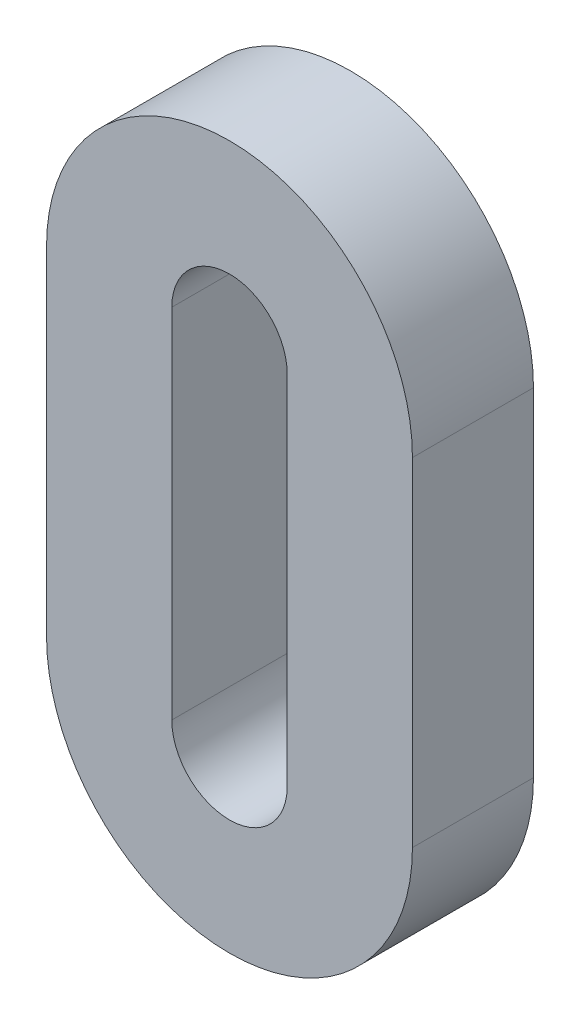
ISO-10303-21;
HEADER;
FILE_DESCRIPTION(('STEP AP214'),'2;1');
FILE_NAME('part.step','',(''),(''),'','','');
FILE_SCHEMA(('AUTOMOTIVE_DESIGN { 1 0 10303 214 1 1 1 1 }'));
ENDSEC;
DATA;
#1=APPLICATION_CONTEXT('core data for automotive mechanical design processes');
#2=APPLICATION_PROTOCOL_DEFINITION('international standard','automotive_design',2000,#1);
#3=PRODUCT_CONTEXT('',#1,'mechanical');
#4=PRODUCT('Part','Part','',(#3));
#5=PRODUCT_RELATED_PRODUCT_CATEGORY('part','',(#4));
#6=PRODUCT_DEFINITION_FORMATION('','',#4);
#7=PRODUCT_DEFINITION_CONTEXT('part definition',#1,'design');
#8=PRODUCT_DEFINITION('design','',#6,#7);
#9=PRODUCT_DEFINITION_SHAPE('','',#8);
#10=(LENGTH_UNIT() NAMED_UNIT(*) SI_UNIT(.MILLI.,.METRE.));
#11=(NAMED_UNIT(*) PLANE_ANGLE_UNIT() SI_UNIT($,.RADIAN.));
#12=(NAMED_UNIT(*) SI_UNIT($,.STERADIAN.) SOLID_ANGLE_UNIT());
#13=UNCERTAINTY_MEASURE_WITH_UNIT(LENGTH_MEASURE(1.E-05),#10,'distance_accuracy_value','');
#14=(GEOMETRIC_REPRESENTATION_CONTEXT(3) GLOBAL_UNCERTAINTY_ASSIGNED_CONTEXT((#13)) GLOBAL_UNIT_ASSIGNED_CONTEXT((#10,
#11,#12)) REPRESENTATION_CONTEXT('',''));
#15=CARTESIAN_POINT('',(0.,0.,0.));
#16=DIRECTION('',(0.,0.,1.));
#17=DIRECTION('',(1.,0.,0.));
#18=AXIS2_PLACEMENT_3D('',#15,#16,#17);
#19=CARTESIAN_POINT('',(-18.0027546578401,6.,4.3));
#20=DIRECTION('',(0.,0.,1.));
#21=DIRECTION('',(1.,0.,0.));
#22=AXIS2_PLACEMENT_3D('',#19,#20,#21);
#23=PLANE('',#22);
#24=CARTESIAN_POINT('',(-18.0027546578401,6.,4.3));
#25=DIRECTION('',(0.,0.,1.));
#26=DIRECTION('',(1.,0.,0.));
#27=AXIS2_PLACEMENT_3D('',#24,#25,#26);
#28=CIRCLE('',#27,6.5);
#29=CARTESIAN_POINT('',(-11.5027546578401,6.,4.3));
#30=VERTEX_POINT('',#29);
#31=CARTESIAN_POINT('',(-24.5027546578401,6.,4.3));
#32=VERTEX_POINT('',#31);
#33=EDGE_CURVE('E134',#30,#32,#28,.T.);
#34=ORIENTED_EDGE('',*,*,#33,.T.);
#35=DIRECTION('',(0.,-1.,0.));
#36=VECTOR('',#35,1.);
#37=CARTESIAN_POINT('',(-24.5027546578401,6.,4.3));
#38=LINE('',#37,#36);
#39=CARTESIAN_POINT('',(-24.5027546578401,-6.,4.3));
#40=VERTEX_POINT('',#39);
#41=EDGE_CURVE('E137',#32,#40,#38,.T.);
#42=ORIENTED_EDGE('',*,*,#41,.T.);
#43=CARTESIAN_POINT('',(-18.0027546578401,-6.,4.3));
#44=DIRECTION('',(0.,0.,1.));
#45=DIRECTION('',(1.,0.,0.));
#46=AXIS2_PLACEMENT_3D('',#43,#44,#45);
#47=CIRCLE('',#46,6.5);
#48=CARTESIAN_POINT('',(-11.5027546578401,-6.,4.3));
#49=VERTEX_POINT('',#48);
#50=EDGE_CURVE('E140',#40,#49,#47,.T.);
#51=ORIENTED_EDGE('',*,*,#50,.T.);
#52=DIRECTION('',(0.,1.,0.));
#53=VECTOR('',#52,1.);
#54=CARTESIAN_POINT('',(-11.5027546578401,6.,4.3));
#55=LINE('',#54,#53);
#56=EDGE_CURVE('E142',#49,#30,#55,.T.);
#57=ORIENTED_EDGE('',*,*,#56,.T.);
#58=EDGE_LOOP('',(#34,#42,#51,#57));
#59=FACE_BOUND('',#58,.T.);
#60=DIRECTION('',(0.,-1.,0.));
#61=VECTOR('',#60,1.);
#62=CARTESIAN_POINT('',(-20.0527546578401,6.35,4.3));
#63=LINE('',#62,#61);
#64=CARTESIAN_POINT('',(-20.0527546578401,6.35,4.3));
#65=VERTEX_POINT('',#64);
#66=CARTESIAN_POINT('',(-20.0527546578401,-6.35,4.3));
#67=VERTEX_POINT('',#66);
#68=EDGE_CURVE('E106',#65,#67,#63,.T.);
#69=ORIENTED_EDGE('',*,*,#68,.F.);
#70=CARTESIAN_POINT('',(-18.0027546578401,6.35,4.3));
#71=DIRECTION('',(0.,0.,1.));
#72=DIRECTION('',(1.,0.,0.));
#73=AXIS2_PLACEMENT_3D('',#70,#71,#72);
#74=CIRCLE('',#73,2.05);
#75=CARTESIAN_POINT('',(-15.9527546578401,6.35,4.3));
#76=VERTEX_POINT('',#75);
#77=EDGE_CURVE('E98',#76,#65,#74,.T.);
#78=ORIENTED_EDGE('',*,*,#77,.F.);
#79=DIRECTION('',(0.,1.,0.));
#80=VECTOR('',#79,1.);
#81=CARTESIAN_POINT('',(-15.9527546578401,6.35,4.3));
#82=LINE('',#81,#80);
#83=CARTESIAN_POINT('',(-15.9527546578401,-6.35,4.3));
#84=VERTEX_POINT('',#83);
#85=EDGE_CURVE('E120',#84,#76,#82,.T.);
#86=ORIENTED_EDGE('',*,*,#85,.F.);
#87=CARTESIAN_POINT('',(-18.0027546578401,-6.35,4.3));
#88=DIRECTION('',(0.,0.,1.));
#89=DIRECTION('',(1.,0.,0.));
#90=AXIS2_PLACEMENT_3D('',#87,#88,#89);
#91=CIRCLE('',#90,2.05);
#92=EDGE_CURVE('E118',#67,#84,#91,.T.);
#93=ORIENTED_EDGE('',*,*,#92,.F.);
#94=EDGE_LOOP('',(#69,#78,#86,#93));
#95=FACE_BOUND('',#94,.T.);
#96=ADVANCED_FACE('F33',(#59,#95),#23,.T.);
#97=CARTESIAN_POINT('',(-18.0027546578401,6.,0.));
#98=DIRECTION('',(0.,0.,1.));
#99=DIRECTION('',(1.,0.,0.));
#100=AXIS2_PLACEMENT_3D('',#97,#98,#99);
#101=PLANE('',#100);
#102=CARTESIAN_POINT('',(-18.0027546578401,6.,0.));
#103=DIRECTION('',(0.,0.,1.));
#104=DIRECTION('',(1.,0.,0.));
#105=AXIS2_PLACEMENT_3D('',#102,#103,#104);
#106=CIRCLE('',#105,6.5);
#107=CARTESIAN_POINT('',(-11.5027546578401,6.,0.));
#108=VERTEX_POINT('',#107);
#109=CARTESIAN_POINT('',(-24.5027546578401,6.,0.));
#110=VERTEX_POINT('',#109);
#111=EDGE_CURVE('E114',#108,#110,#106,.T.);
#112=ORIENTED_EDGE('',*,*,#111,.F.);
#113=DIRECTION('',(0.,1.,0.));
#114=VECTOR('',#113,1.);
#115=CARTESIAN_POINT('',(-11.5027546578401,6.,0.));
#116=LINE('',#115,#114);
#117=CARTESIAN_POINT('',(-11.5027546578401,-6.,0.));
#118=VERTEX_POINT('',#117);
#119=EDGE_CURVE('E138',#118,#108,#116,.T.);
#120=ORIENTED_EDGE('',*,*,#119,.F.);
#121=CARTESIAN_POINT('',(-18.0027546578401,-6.,0.));
#122=DIRECTION('',(0.,0.,1.));
#123=DIRECTION('',(1.,0.,0.));
#124=AXIS2_PLACEMENT_3D('',#121,#122,#123);
#125=CIRCLE('',#124,6.5);
#126=CARTESIAN_POINT('',(-24.5027546578401,-6.,0.));
#127=VERTEX_POINT('',#126);
#128=EDGE_CURVE('E149',#127,#118,#125,.T.);
#129=ORIENTED_EDGE('',*,*,#128,.F.);
#130=DIRECTION('',(0.,-1.,0.));
#131=VECTOR('',#130,1.);
#132=CARTESIAN_POINT('',(-24.5027546578401,6.,0.));
#133=LINE('',#132,#131);
#134=EDGE_CURVE('E147',#110,#127,#133,.T.);
#135=ORIENTED_EDGE('',*,*,#134,.F.);
#136=EDGE_LOOP('',(#112,#120,#129,#135));
#137=FACE_BOUND('',#136,.T.);
#138=CARTESIAN_POINT('',(-18.0027546578401,6.35,0.));
#139=DIRECTION('',(0.,0.,1.));
#140=DIRECTION('',(1.,0.,0.));
#141=AXIS2_PLACEMENT_3D('',#138,#139,#140);
#142=CIRCLE('',#141,2.05);
#143=CARTESIAN_POINT('',(-15.9527546578401,6.35,0.));
#144=VERTEX_POINT('',#143);
#145=CARTESIAN_POINT('',(-20.0527546578401,6.35,0.));
#146=VERTEX_POINT('',#145);
#147=EDGE_CURVE('E56',#144,#146,#142,.T.);
#148=ORIENTED_EDGE('',*,*,#147,.T.);
#149=DIRECTION('',(0.,-1.,0.));
#150=VECTOR('',#149,1.);
#151=CARTESIAN_POINT('',(-20.0527546578401,6.35,0.));
#152=LINE('',#151,#150);
#153=CARTESIAN_POINT('',(-20.0527546578401,-6.35,0.));
#154=VERTEX_POINT('',#153);
#155=EDGE_CURVE('E113',#146,#154,#152,.T.);
#156=ORIENTED_EDGE('',*,*,#155,.T.);
#157=CARTESIAN_POINT('',(-18.0027546578401,-6.35,0.));
#158=DIRECTION('',(0.,0.,1.));
#159=DIRECTION('',(1.,0.,0.));
#160=AXIS2_PLACEMENT_3D('',#157,#158,#159);
#161=CIRCLE('',#160,2.05);
#162=CARTESIAN_POINT('',(-15.9527546578401,-6.35,0.));
#163=VERTEX_POINT('',#162);
#164=EDGE_CURVE('E126',#154,#163,#161,.T.);
#165=ORIENTED_EDGE('',*,*,#164,.T.);
#166=DIRECTION('',(0.,1.,0.));
#167=VECTOR('',#166,1.);
#168=CARTESIAN_POINT('',(-15.9527546578401,6.35,0.));
#169=LINE('',#168,#167);
#170=EDGE_CURVE('E107',#163,#144,#169,.T.);
#171=ORIENTED_EDGE('',*,*,#170,.T.);
#172=EDGE_LOOP('',(#148,#156,#165,#171));
#173=FACE_BOUND('',#172,.T.);
#174=ADVANCED_FACE('F167',(#137,#173),#101,.F.);
#175=CARTESIAN_POINT('',(-18.0027546578401,6.,4.3));
#176=DIRECTION('',(0.,0.,-1.));
#177=DIRECTION('',(-1.,0.,0.));
#178=AXIS2_PLACEMENT_3D('',#175,#176,#177);
#179=CYLINDRICAL_SURFACE('',#178,6.5);
#180=ORIENTED_EDGE('',*,*,#111,.T.);
#181=DIRECTION('',(0.,0.,-1.));
#182=VECTOR('',#181,1.);
#183=CARTESIAN_POINT('',(-24.5027546578401,6.,4.3));
#184=LINE('',#183,#182);
#185=EDGE_CURVE('E11',#32,#110,#184,.T.);
#186=ORIENTED_EDGE('',*,*,#185,.F.);
#187=ORIENTED_EDGE('',*,*,#33,.F.);
#188=DIRECTION('',(0.,0.,-1.));
#189=VECTOR('',#188,1.);
#190=CARTESIAN_POINT('',(-11.5027546578401,6.,4.3));
#191=LINE('',#190,#189);
#192=EDGE_CURVE('E144',#30,#108,#191,.T.);
#193=ORIENTED_EDGE('',*,*,#192,.T.);
#194=EDGE_LOOP('',(#180,#186,#187,#193));
#195=FACE_BOUND('',#194,.T.);
#196=ADVANCED_FACE('F35',(#195),#179,.T.);
#197=CARTESIAN_POINT('',(-24.5027546578401,6.,4.3));
#198=DIRECTION('',(1.,0.,0.));
#199=DIRECTION('',(0.,0.,-1.));
#200=AXIS2_PLACEMENT_3D('',#197,#198,#199);
#201=PLANE('',#200);
#202=ORIENTED_EDGE('',*,*,#134,.T.);
#203=DIRECTION('',(0.,0.,-1.));
#204=VECTOR('',#203,1.);
#205=CARTESIAN_POINT('',(-24.5027546578401,-6.,4.3));
#206=LINE('',#205,#204);
#207=EDGE_CURVE('E41',#40,#127,#206,.T.);
#208=ORIENTED_EDGE('',*,*,#207,.F.);
#209=ORIENTED_EDGE('',*,*,#41,.F.);
#210=ORIENTED_EDGE('',*,*,#185,.T.);
#211=EDGE_LOOP('',(#202,#208,#209,#210));
#212=FACE_BOUND('',#211,.T.);
#213=ADVANCED_FACE('F177',(#212),#201,.F.);
#214=CARTESIAN_POINT('',(-18.0027546578401,-6.,4.3));
#215=DIRECTION('',(0.,0.,-1.));
#216=DIRECTION('',(-1.,0.,0.));
#217=AXIS2_PLACEMENT_3D('',#214,#215,#216);
#218=CYLINDRICAL_SURFACE('',#217,6.5);
#219=ORIENTED_EDGE('',*,*,#128,.T.);
#220=DIRECTION('',(0.,0.,-1.));
#221=VECTOR('',#220,1.);
#222=CARTESIAN_POINT('',(-11.5027546578401,-6.,4.3));
#223=LINE('',#222,#221);
#224=EDGE_CURVE('E154',#49,#118,#223,.T.);
#225=ORIENTED_EDGE('',*,*,#224,.F.);
#226=ORIENTED_EDGE('',*,*,#50,.F.);
#227=ORIENTED_EDGE('',*,*,#207,.T.);
#228=EDGE_LOOP('',(#219,#225,#226,#227));
#229=FACE_BOUND('',#228,.T.);
#230=ADVANCED_FACE('F161',(#229),#218,.T.);
#231=CARTESIAN_POINT('',(-11.5027546578401,6.,4.3));
#232=DIRECTION('',(-1.,0.,0.));
#233=DIRECTION('',(0.,0.,1.));
#234=AXIS2_PLACEMENT_3D('',#231,#232,#233);
#235=PLANE('',#234);
#236=ORIENTED_EDGE('',*,*,#119,.T.);
#237=ORIENTED_EDGE('',*,*,#192,.F.);
#238=ORIENTED_EDGE('',*,*,#56,.F.);
#239=ORIENTED_EDGE('',*,*,#224,.T.);
#240=EDGE_LOOP('',(#236,#237,#238,#239));
#241=FACE_BOUND('',#240,.T.);
#242=ADVANCED_FACE('F171',(#241),#235,.F.);
#243=CARTESIAN_POINT('',(-18.0027546578401,6.35,4.3));
#244=DIRECTION('',(0.,0.,-1.));
#245=DIRECTION('',(-1.,0.,0.));
#246=AXIS2_PLACEMENT_3D('',#243,#244,#245);
#247=CYLINDRICAL_SURFACE('',#246,2.05);
#248=ORIENTED_EDGE('',*,*,#147,.F.);
#249=DIRECTION('',(0.,0.,-1.));
#250=VECTOR('',#249,1.);
#251=CARTESIAN_POINT('',(-15.9527546578401,6.35,4.3));
#252=LINE('',#251,#250);
#253=EDGE_CURVE('E102',#76,#144,#252,.T.);
#254=ORIENTED_EDGE('',*,*,#253,.F.);
#255=ORIENTED_EDGE('',*,*,#77,.T.);
#256=DIRECTION('',(0.,0.,-1.));
#257=VECTOR('',#256,1.);
#258=CARTESIAN_POINT('',(-20.0527546578401,6.35,4.3));
#259=LINE('',#258,#257);
#260=EDGE_CURVE('E101',#65,#146,#259,.T.);
#261=ORIENTED_EDGE('',*,*,#260,.T.);
#262=EDGE_LOOP('',(#248,#254,#255,#261));
#263=FACE_BOUND('',#262,.T.);
#264=ADVANCED_FACE('F100',(#263),#247,.F.);
#265=CARTESIAN_POINT('',(-20.0527546578401,6.35,4.3));
#266=DIRECTION('',(1.,0.,0.));
#267=DIRECTION('',(0.,0.,-1.));
#268=AXIS2_PLACEMENT_3D('',#265,#266,#267);
#269=PLANE('',#268);
#270=ORIENTED_EDGE('',*,*,#155,.F.);
#271=ORIENTED_EDGE('',*,*,#260,.F.);
#272=ORIENTED_EDGE('',*,*,#68,.T.);
#273=DIRECTION('',(0.,0.,-1.));
#274=VECTOR('',#273,1.);
#275=CARTESIAN_POINT('',(-20.0527546578401,-6.35,4.3));
#276=LINE('',#275,#274);
#277=EDGE_CURVE('E115',#67,#154,#276,.T.);
#278=ORIENTED_EDGE('',*,*,#277,.T.);
#279=EDGE_LOOP('',(#270,#271,#272,#278));
#280=FACE_BOUND('',#279,.T.);
#281=ADVANCED_FACE('F110',(#280),#269,.T.);
#282=CARTESIAN_POINT('',(-18.0027546578401,-6.35,4.3));
#283=DIRECTION('',(0.,0.,-1.));
#284=DIRECTION('',(-1.,0.,0.));
#285=AXIS2_PLACEMENT_3D('',#282,#283,#284);
#286=CYLINDRICAL_SURFACE('',#285,2.05);
#287=ORIENTED_EDGE('',*,*,#164,.F.);
#288=ORIENTED_EDGE('',*,*,#277,.F.);
#289=ORIENTED_EDGE('',*,*,#92,.T.);
#290=DIRECTION('',(0.,0.,-1.));
#291=VECTOR('',#290,1.);
#292=CARTESIAN_POINT('',(-15.9527546578401,-6.35,4.3));
#293=LINE('',#292,#291);
#294=EDGE_CURVE('E48',#84,#163,#293,.T.);
#295=ORIENTED_EDGE('',*,*,#294,.T.);
#296=EDGE_LOOP('',(#287,#288,#289,#295));
#297=FACE_BOUND('',#296,.T.);
#298=ADVANCED_FACE('F200',(#297),#286,.F.);
#299=CARTESIAN_POINT('',(-15.9527546578401,6.35,4.3));
#300=DIRECTION('',(-1.,0.,0.));
#301=DIRECTION('',(0.,0.,1.));
#302=AXIS2_PLACEMENT_3D('',#299,#300,#301);
#303=PLANE('',#302);
#304=ORIENTED_EDGE('',*,*,#170,.F.);
#305=ORIENTED_EDGE('',*,*,#294,.F.);
#306=ORIENTED_EDGE('',*,*,#85,.T.);
#307=ORIENTED_EDGE('',*,*,#253,.T.);
#308=EDGE_LOOP('',(#304,#305,#306,#307));
#309=FACE_BOUND('',#308,.T.);
#310=ADVANCED_FACE('F204',(#309),#303,.T.);
#311=CLOSED_SHELL('',(#96,#174,#196,#213,#230,#242,#264,#281,#298,#310));
#312=MANIFOLD_SOLID_BREP('B2',#311);
#313=ADVANCED_BREP_SHAPE_REPRESENTATION('',(#18,#312),#14);
#314=SHAPE_DEFINITION_REPRESENTATION(#9,#313);
ENDSEC;
END-ISO-10303-21;
